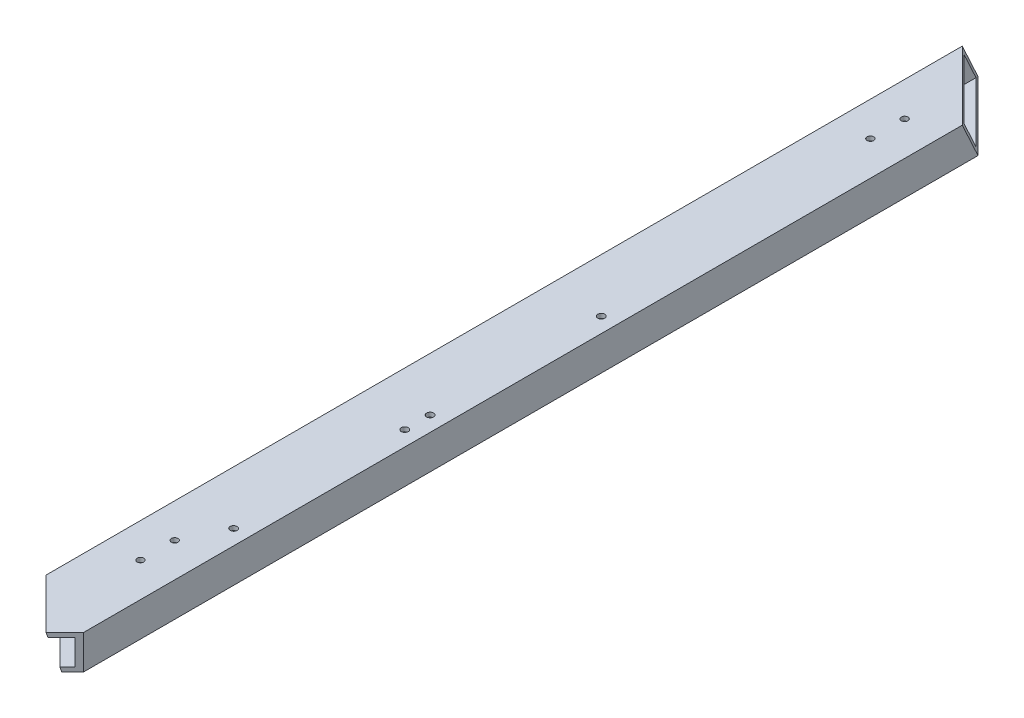
ISO-10303-21;
HEADER;
FILE_DESCRIPTION(('STEP AP214'),'2;1');
FILE_NAME('part.step','',(''),(''),'','','');
FILE_SCHEMA(('AUTOMOTIVE_DESIGN { 1 0 10303 214 1 1 1 1 }'));
ENDSEC;
DATA;
#1=APPLICATION_CONTEXT('core data for automotive mechanical design processes');
#2=APPLICATION_PROTOCOL_DEFINITION('international standard','automotive_design',2000,#1);
#3=PRODUCT_CONTEXT('',#1,'mechanical');
#4=PRODUCT('Part','Part','',(#3));
#5=PRODUCT_RELATED_PRODUCT_CATEGORY('part','',(#4));
#6=PRODUCT_DEFINITION_FORMATION('','',#4);
#7=PRODUCT_DEFINITION_CONTEXT('part definition',#1,'design');
#8=PRODUCT_DEFINITION('design','',#6,#7);
#9=PRODUCT_DEFINITION_SHAPE('','',#8);
#10=(LENGTH_UNIT() NAMED_UNIT(*) SI_UNIT(.MILLI.,.METRE.));
#11=(NAMED_UNIT(*) PLANE_ANGLE_UNIT() SI_UNIT($,.RADIAN.));
#12=(NAMED_UNIT(*) SI_UNIT($,.STERADIAN.) SOLID_ANGLE_UNIT());
#13=UNCERTAINTY_MEASURE_WITH_UNIT(LENGTH_MEASURE(1.E-05),#10,'distance_accuracy_value','');
#14=(GEOMETRIC_REPRESENTATION_CONTEXT(3) GLOBAL_UNCERTAINTY_ASSIGNED_CONTEXT((#13)) GLOBAL_UNIT_ASSIGNED_CONTEXT((#10,
#11,#12)) REPRESENTATION_CONTEXT('',''));
#15=CARTESIAN_POINT('',(0.,0.,0.));
#16=DIRECTION('',(0.,0.,1.));
#17=DIRECTION('',(1.,0.,0.));
#18=AXIS2_PLACEMENT_3D('',#15,#16,#17);
#19=CARTESIAN_POINT('',(25.4,38.1,771.9314));
#20=DIRECTION('',(-1.,0.,0.));
#21=DIRECTION('',(0.,0.,1.));
#22=AXIS2_PLACEMENT_3D('',#19,#20,#21);
#23=PLANE('',#22);
#24=DIRECTION('',(0.,0.90866085456603,0.417534970247202));
#25=VECTOR('',#24,1.);
#26=CARTESIAN_POINT('',(25.4,307.267461744109,186.155469267859));
#27=LINE('',#26,#25);
#28=CARTESIAN_POINT('',(25.3999999999999,12.7,50.7999999999986));
#29=VERTEX_POINT('',#28);
#30=CARTESIAN_POINT('',(25.4,38.1,62.4714483638043));
#31=VERTEX_POINT('',#30);
#32=EDGE_CURVE('E132',#29,#31,#27,.T.);
#33=ORIENTED_EDGE('',*,*,#32,.T.);
#34=DIRECTION('',(0.,0.,-1.));
#35=VECTOR('',#34,1.);
#36=CARTESIAN_POINT('',(25.4,38.1,771.9314));
#37=LINE('',#36,#35);
#38=CARTESIAN_POINT('',(25.4,38.1,714.375));
#39=VERTEX_POINT('',#38);
#40=EDGE_CURVE('E162',#39,#31,#37,.T.);
#41=ORIENTED_EDGE('',*,*,#40,.F.);
#42=DIRECTION('',(0.,-1.,0.));
#43=VECTOR('',#42,1.);
#44=CARTESIAN_POINT('',(25.4,38.1,714.375));
#45=LINE('',#44,#43);
#46=CARTESIAN_POINT('',(25.4,12.7,714.375));
#47=VERTEX_POINT('',#46);
#48=EDGE_CURVE('E135',#39,#47,#45,.T.);
#49=ORIENTED_EDGE('',*,*,#48,.T.);
#50=DIRECTION('',(0.,0.,-1.));
#51=VECTOR('',#50,1.);
#52=CARTESIAN_POINT('',(25.4,12.7,771.9314));
#53=LINE('',#52,#51);
#54=EDGE_CURVE('E40',#47,#29,#53,.T.);
#55=ORIENTED_EDGE('',*,*,#54,.T.);
#56=EDGE_LOOP('',(#33,#41,#49,#55));
#57=FACE_BOUND('',#56,.T.);
#58=ADVANCED_FACE('F32',(#57),#23,.F.);
#59=CARTESIAN_POINT('',(-25.4,38.1,771.9314));
#60=DIRECTION('',(1.,0.,0.));
#61=DIRECTION('',(0.,0.,-1.));
#62=AXIS2_PLACEMENT_3D('',#59,#60,#61);
#63=PLANE('',#62);
#64=DIRECTION('',(0.,0.,-1.));
#65=VECTOR('',#64,1.);
#66=CARTESIAN_POINT('',(-25.4,38.1,771.9314));
#67=LINE('',#66,#65);
#68=CARTESIAN_POINT('',(-25.4,38.1,691.557478073252));
#69=VERTEX_POINT('',#68);
#70=CARTESIAN_POINT('',(-25.4,38.1,11.6714483638057));
#71=VERTEX_POINT('',#70);
#72=EDGE_CURVE('E165',#69,#71,#67,.T.);
#73=ORIENTED_EDGE('',*,*,#72,.T.);
#74=DIRECTION('',(0.,-0.90866085456603,-0.417534970247202));
#75=VECTOR('',#74,1.);
#76=CARTESIAN_POINT('',(-25.4,326.54086403421,144.211710197931));
#77=LINE('',#76,#75);
#78=CARTESIAN_POINT('',(-25.4,12.7,0.));
#79=VERTEX_POINT('',#78);
#80=EDGE_CURVE('E138',#71,#79,#77,.T.);
#81=ORIENTED_EDGE('',*,*,#80,.T.);
#82=DIRECTION('',(0.,0.,-1.));
#83=VECTOR('',#82,1.);
#84=CARTESIAN_POINT('',(-25.4,12.7,771.9314));
#85=LINE('',#84,#83);
#86=CARTESIAN_POINT('',(-25.4000000000001,12.7,679.886029709446));
#87=VERTEX_POINT('',#86);
#88=EDGE_CURVE('E168',#87,#79,#85,.T.);
#89=ORIENTED_EDGE('',*,*,#88,.F.);
#90=DIRECTION('',(0.,-0.90866085456603,-0.417534970247202));
#91=VECTOR('',#90,1.);
#92=CARTESIAN_POINT('',(-25.4,68.5936797426668,705.569502031478));
#93=LINE('',#92,#91);
#94=EDGE_CURVE('E121',#69,#87,#93,.T.);
#95=ORIENTED_EDGE('',*,*,#94,.F.);
#96=EDGE_LOOP('',(#73,#81,#89,#95));
#97=FACE_BOUND('',#96,.T.);
#98=ADVANCED_FACE('F281',(#97),#63,.F.);
#99=CARTESIAN_POINT('',(-25.4,38.1,771.9314));
#100=DIRECTION('',(0.,-1.,0.));
#101=DIRECTION('',(0.,0.,1.));
#102=AXIS2_PLACEMENT_3D('',#99,#100,#101);
#103=PLANE('',#102);
#104=CARTESIAN_POINT('',(14.2366999999987,38.1,446.172239036629));
#105=DIRECTION('',(0.,1.,0.));
#106=DIRECTION('',(0.,0.,1.));
#107=AXIS2_PLACEMENT_3D('',#104,#105,#106);
#108=CIRCLE('',#107,2.57975099999999);
#109=CARTESIAN_POINT('',(14.2366999999987,38.1,448.751990036629));
#110=VERTEX_POINT('',#109);
#111=EDGE_CURVE('E544',#110,#110,#108,.T.);
#112=ORIENTED_EDGE('',*,*,#111,.F.);
#113=EDGE_LOOP('',(#112));
#114=FACE_BOUND('',#113,.T.);
#115=CARTESIAN_POINT('',(14.2367000000014,38.1,591.968239036627));
#116=DIRECTION('',(0.,1.,0.));
#117=DIRECTION('',(0.,0.,1.));
#118=AXIS2_PLACEMENT_3D('',#115,#116,#117);
#119=CIRCLE('',#118,2.57975099999999);
#120=CARTESIAN_POINT('',(14.2367000000014,38.1,594.547990036627));
#121=VERTEX_POINT('',#120);
#122=EDGE_CURVE('E185',#121,#121,#119,.T.);
#123=ORIENTED_EDGE('',*,*,#122,.F.);
#124=EDGE_LOOP('',(#123));
#125=FACE_BOUND('',#124,.T.);
#126=CARTESIAN_POINT('',(14.2367000000049,38.1,319.172239036625));
#127=DIRECTION('',(0.,-1.,0.));
#128=DIRECTION('',(0.,0.,-1.));
#129=AXIS2_PLACEMENT_3D('',#126,#127,#128);
#130=CIRCLE('',#129,2.57975099999999);
#131=CARTESIAN_POINT('',(14.2367000000049,38.1,316.592488036625));
#132=VERTEX_POINT('',#131);
#133=EDGE_CURVE('E182',#132,#132,#130,.T.);
#134=ORIENTED_EDGE('',*,*,#133,.T.);
#135=EDGE_LOOP('',(#134));
#136=FACE_BOUND('',#135,.T.);
#137=CARTESIAN_POINT('',(14.2367000000001,38.1,464.968239036626));
#138=DIRECTION('',(0.,-1.,0.));
#139=DIRECTION('',(0.,0.,-1.));
#140=AXIS2_PLACEMENT_3D('',#137,#138,#139);
#141=CIRCLE('',#140,2.57975099999999);
#142=CARTESIAN_POINT('',(14.2367000000001,38.1,462.388488036626));
#143=VERTEX_POINT('',#142);
#144=EDGE_CURVE('E200',#143,#143,#141,.T.);
#145=ORIENTED_EDGE('',*,*,#144,.T.);
#146=EDGE_LOOP('',(#145));
#147=FACE_BOUND('',#146,.T.);
#148=CARTESIAN_POINT('',(-6.24500451351651E-12,38.1,621.467704493594));
#149=DIRECTION('',(0.,1.,0.));
#150=DIRECTION('',(0.,0.,1.));
#151=AXIS2_PLACEMENT_3D('',#148,#149,#150);
#152=CIRCLE('',#151,2.4638);
#153=CARTESIAN_POINT('',(-6.24500451351651E-12,38.1,623.931504493594));
#154=VERTEX_POINT('',#153);
#155=EDGE_CURVE('E213',#154,#154,#152,.T.);
#156=ORIENTED_EDGE('',*,*,#155,.F.);
#157=EDGE_LOOP('',(#156));
#158=FACE_BOUND('',#157,.T.);
#159=CARTESIAN_POINT('',(-6.00561267383171E-12,38.1,646.867704493594));
#160=DIRECTION('',(0.,1.,0.));
#161=DIRECTION('',(0.,0.,1.));
#162=AXIS2_PLACEMENT_3D('',#159,#160,#161);
#163=CIRCLE('',#162,2.4638);
#164=CARTESIAN_POINT('',(-6.00561267383171E-12,38.1,649.331504493594));
#165=VERTEX_POINT('',#164);
#166=EDGE_CURVE('E225',#165,#165,#163,.T.);
#167=ORIENTED_EDGE('',*,*,#166,.F.);
#168=EDGE_LOOP('',(#167));
#169=FACE_BOUND('',#168,.T.);
#170=CARTESIAN_POINT('',(-1.99840144432528E-12,38.1,79.8576765553637));
#171=DIRECTION('',(0.,-1.,0.));
#172=DIRECTION('',(0.,0.,-1.));
#173=AXIS2_PLACEMENT_3D('',#170,#171,#172);
#174=CIRCLE('',#173,2.4638);
#175=CARTESIAN_POINT('',(-1.99840144432528E-12,38.1,77.3938765553637));
#176=VERTEX_POINT('',#175);
#177=EDGE_CURVE('E236',#176,#176,#174,.T.);
#178=ORIENTED_EDGE('',*,*,#177,.T.);
#179=EDGE_LOOP('',(#178));
#180=FACE_BOUND('',#179,.T.);
#181=CARTESIAN_POINT('',(-1.74166236988071E-12,38.1,105.257676555364));
#182=DIRECTION('',(0.,-1.,0.));
#183=DIRECTION('',(0.,0.,-1.));
#184=AXIS2_PLACEMENT_3D('',#181,#182,#183);
#185=CIRCLE('',#184,2.4638);
#186=CARTESIAN_POINT('',(-1.74166236988071E-12,38.1,102.793876555364));
#187=VERTEX_POINT('',#186);
#188=EDGE_CURVE('E248',#187,#187,#185,.T.);
#189=ORIENTED_EDGE('',*,*,#188,.T.);
#190=EDGE_LOOP('',(#189));
#191=FACE_BOUND('',#190,.T.);
#192=DIRECTION('',(-0.707106781186544,0.,0.707106781186551));
#193=VECTOR('',#192,1.);
#194=CARTESIAN_POINT('',(-3.37820000000001,38.1,743.1532));
#195=LINE('',#194,#193);
#196=CARTESIAN_POINT('',(11.4087609633743,38.1,728.366239036625));
#197=VERTEX_POINT('',#196);
#198=EDGE_CURVE('E131',#39,#197,#195,.T.);
#199=ORIENTED_EDGE('',*,*,#198,.F.);
#200=ORIENTED_EDGE('',*,*,#40,.T.);
#201=DIRECTION('',(-0.707106781186557,0.,-0.707106781186538));
#202=VECTOR('',#201,1.);
#203=CARTESIAN_POINT('',(365.740875818098,38.1,402.812324181893));
#204=LINE('',#203,#202);
#205=EDGE_CURVE('E269',#31,#71,#204,.T.);
#206=ORIENTED_EDGE('',*,*,#205,.T.);
#207=ORIENTED_EDGE('',*,*,#72,.F.);
#208=DIRECTION('',(0.707106781186551,0.,0.707106781186544));
#209=VECTOR('',#208,1.);
#210=CARTESIAN_POINT('',(-534.429166587454,38.1,182.528311485803));
#211=LINE('',#210,#209);
#212=EDGE_CURVE('E126',#69,#197,#211,.T.);
#213=ORIENTED_EDGE('',*,*,#212,.T.);
#214=EDGE_LOOP('',(#199,#200,#206,#207,#213));
#215=FACE_BOUND('',#214,.T.);
#216=ADVANCED_FACE('F290',(#114,#125,#136,#147,#158,#169,#180,#191,#215),#103,.F.);
#217=CARTESIAN_POINT('',(-22.225,34.925,771.9314));
#218=DIRECTION('',(1.,0.,0.));
#219=DIRECTION('',(0.,0.,-1.));
#220=AXIS2_PLACEMENT_3D('',#217,#218,#219);
#221=PLANE('',#220);
#222=DIRECTION('',(0.,-0.90866085456603,-0.417534970247202));
#223=VECTOR('',#222,1.);
#224=CARTESIAN_POINT('',(-22.225,64.7676071576649,706.986399330218));
#225=LINE('',#224,#223);
#226=CARTESIAN_POINT('',(-22.225,34.925,693.273547027776));
#227=VERTEX_POINT('',#226);
#228=CARTESIAN_POINT('',(-22.225,15.875,684.519960754921));
#229=VERTEX_POINT('',#228);
#230=EDGE_CURVE('E263',#227,#229,#225,.T.);
#231=ORIENTED_EDGE('',*,*,#230,.T.);
#232=DIRECTION('',(0.,0.,-1.));
#233=VECTOR('',#232,1.);
#234=CARTESIAN_POINT('',(-22.225,15.875,771.9314));
#235=LINE('',#234,#233);
#236=CARTESIAN_POINT('',(-22.2250000000001,15.875,4.63393104547549));
#237=VERTEX_POINT('',#236);
#238=EDGE_CURVE('E150',#229,#237,#235,.T.);
#239=ORIENTED_EDGE('',*,*,#238,.T.);
#240=DIRECTION('',(0.,-0.90866085456603,-0.417534970247202));
#241=VECTOR('',#240,1.);
#242=CARTESIAN_POINT('',(-22.225,322.714791449209,145.62860749667));
#243=LINE('',#242,#241);
#244=CARTESIAN_POINT('',(-22.2250000000001,34.925,13.3875173183298));
#245=VERTEX_POINT('',#244);
#246=EDGE_CURVE('E276',#245,#237,#243,.T.);
#247=ORIENTED_EDGE('',*,*,#246,.F.);
#248=DIRECTION('',(0.,0.,-1.));
#249=VECTOR('',#248,1.);
#250=CARTESIAN_POINT('',(-22.225,34.925,771.9314));
#251=LINE('',#250,#249);
#252=EDGE_CURVE('E159',#227,#245,#251,.T.);
#253=ORIENTED_EDGE('',*,*,#252,.F.);
#254=EDGE_LOOP('',(#231,#239,#247,#253));
#255=FACE_BOUND('',#254,.T.);
#256=ADVANCED_FACE('F292',(#255),#221,.T.);
#257=CARTESIAN_POINT('',(-22.225,34.925,771.9314));
#258=DIRECTION('',(0.,-1.,0.));
#259=DIRECTION('',(0.,0.,1.));
#260=AXIS2_PLACEMENT_3D('',#257,#258,#259);
#261=PLANE('',#260);
#262=CARTESIAN_POINT('',(14.2366999999987,34.925,446.172239036629));
#263=DIRECTION('',(0.,-1.,0.));
#264=DIRECTION('',(0.,0.,-1.));
#265=AXIS2_PLACEMENT_3D('',#262,#263,#264);
#266=CIRCLE('',#265,2.57975099999999);
#267=CARTESIAN_POINT('',(14.2366999999987,34.925,443.592488036629));
#268=VERTEX_POINT('',#267);
#269=EDGE_CURVE('E35',#268,#268,#266,.T.);
#270=ORIENTED_EDGE('',*,*,#269,.F.);
#271=EDGE_LOOP('',(#270));
#272=FACE_BOUND('',#271,.T.);
#273=CARTESIAN_POINT('',(14.2367000000014,34.925,591.968239036627));
#274=DIRECTION('',(0.,-1.,0.));
#275=DIRECTION('',(0.,0.,-1.));
#276=AXIS2_PLACEMENT_3D('',#273,#274,#275);
#277=CIRCLE('',#276,2.57975099999999);
#278=CARTESIAN_POINT('',(14.2367000000014,34.925,589.388488036627));
#279=VERTEX_POINT('',#278);
#280=EDGE_CURVE('E177',#279,#279,#277,.T.);
#281=ORIENTED_EDGE('',*,*,#280,.F.);
#282=EDGE_LOOP('',(#281));
#283=FACE_BOUND('',#282,.T.);
#284=CARTESIAN_POINT('',(14.2367000000049,34.925,319.172239036625));
#285=DIRECTION('',(0.,1.,0.));
#286=DIRECTION('',(0.,0.,1.));
#287=AXIS2_PLACEMENT_3D('',#284,#285,#286);
#288=CIRCLE('',#287,2.57975099999999);
#289=CARTESIAN_POINT('',(14.2367000000049,34.925,321.751990036625));
#290=VERTEX_POINT('',#289);
#291=EDGE_CURVE('E173',#290,#290,#288,.T.);
#292=ORIENTED_EDGE('',*,*,#291,.T.);
#293=EDGE_LOOP('',(#292));
#294=FACE_BOUND('',#293,.T.);
#295=CARTESIAN_POINT('',(14.2367000000001,34.925,464.968239036626));
#296=DIRECTION('',(0.,1.,0.));
#297=DIRECTION('',(0.,0.,1.));
#298=AXIS2_PLACEMENT_3D('',#295,#296,#297);
#299=CIRCLE('',#298,2.57975099999999);
#300=CARTESIAN_POINT('',(14.2367000000001,34.925,467.547990036625));
#301=VERTEX_POINT('',#300);
#302=EDGE_CURVE('E209',#301,#301,#299,.T.);
#303=ORIENTED_EDGE('',*,*,#302,.T.);
#304=EDGE_LOOP('',(#303));
#305=FACE_BOUND('',#304,.T.);
#306=CARTESIAN_POINT('',(-6.24500451351651E-12,34.925,621.467704493594));
#307=DIRECTION('',(0.,1.,0.));
#308=DIRECTION('',(0.,0.,1.));
#309=AXIS2_PLACEMENT_3D('',#306,#307,#308);
#310=CIRCLE('',#309,2.4638);
#311=CARTESIAN_POINT('',(-6.24500451351651E-12,34.925,623.931504493594));
#312=VERTEX_POINT('',#311);
#313=EDGE_CURVE('E221',#312,#312,#310,.T.);
#314=ORIENTED_EDGE('',*,*,#313,.T.);
#315=EDGE_LOOP('',(#314));
#316=FACE_BOUND('',#315,.T.);
#317=CARTESIAN_POINT('',(-6.00561267383171E-12,34.925,646.867704493594));
#318=DIRECTION('',(0.,1.,0.));
#319=DIRECTION('',(0.,0.,1.));
#320=AXIS2_PLACEMENT_3D('',#317,#318,#319);
#321=CIRCLE('',#320,2.4638);
#322=CARTESIAN_POINT('',(-6.00561267383171E-12,34.925,649.331504493594));
#323=VERTEX_POINT('',#322);
#324=EDGE_CURVE('E233',#323,#323,#321,.T.);
#325=ORIENTED_EDGE('',*,*,#324,.T.);
#326=EDGE_LOOP('',(#325));
#327=FACE_BOUND('',#326,.T.);
#328=CARTESIAN_POINT('',(-1.99840144432528E-12,34.925,79.8576765553637));
#329=DIRECTION('',(0.,1.,0.));
#330=DIRECTION('',(0.,0.,1.));
#331=AXIS2_PLACEMENT_3D('',#328,#329,#330);
#332=CIRCLE('',#331,2.4638);
#333=CARTESIAN_POINT('',(-1.99840144432528E-12,34.925,82.3214765553637));
#334=VERTEX_POINT('',#333);
#335=EDGE_CURVE('E245',#334,#334,#332,.T.);
#336=ORIENTED_EDGE('',*,*,#335,.T.);
#337=EDGE_LOOP('',(#336));
#338=FACE_BOUND('',#337,.T.);
#339=CARTESIAN_POINT('',(-1.74166236988071E-12,34.925,105.257676555364));
#340=DIRECTION('',(0.,1.,0.));
#341=DIRECTION('',(0.,0.,1.));
#342=AXIS2_PLACEMENT_3D('',#339,#340,#341);
#343=CIRCLE('',#342,2.4638);
#344=CARTESIAN_POINT('',(-1.74166236988071E-12,34.925,107.721476555364));
#345=VERTEX_POINT('',#344);
#346=EDGE_CURVE('E257',#345,#345,#343,.T.);
#347=ORIENTED_EDGE('',*,*,#346,.T.);
#348=EDGE_LOOP('',(#347));
#349=FACE_BOUND('',#348,.T.);
#350=DIRECTION('',(-0.707106781186551,0.,-0.707106781186544));
#351=VECTOR('',#350,1.);
#352=CARTESIAN_POINT('',(17.1039264861121,34.925,732.602473513887));
#353=LINE('',#352,#351);
#354=CARTESIAN_POINT('',(12.1382264861122,34.925,727.636773513888));
#355=VERTEX_POINT('',#354);
#356=EDGE_CURVE('E266',#355,#227,#353,.T.);
#357=ORIENTED_EDGE('',*,*,#356,.T.);
#358=ORIENTED_EDGE('',*,*,#252,.T.);
#359=DIRECTION('',(-0.707106781186557,0.,-0.707106781186538));
#360=VECTOR('',#359,1.);
#361=CARTESIAN_POINT('',(357.046941340835,34.925,392.659458659155));
#362=LINE('',#361,#360);
#363=CARTESIAN_POINT('',(22.225,34.9249999999999,57.8375173183287));
#364=VERTEX_POINT('',#363);
#365=EDGE_CURVE('E274',#364,#245,#362,.T.);
#366=ORIENTED_EDGE('',*,*,#365,.F.);
#367=DIRECTION('',(0.,0.,-1.));
#368=VECTOR('',#367,1.);
#369=CARTESIAN_POINT('',(22.225,34.925,771.9314));
#370=LINE('',#369,#368);
#371=CARTESIAN_POINT('',(22.225,34.925,717.55));
#372=VERTEX_POINT('',#371);
#373=EDGE_CURVE('E156',#372,#364,#370,.T.);
#374=ORIENTED_EDGE('',*,*,#373,.F.);
#375=DIRECTION('',(-0.707106781186544,0.,0.707106781186551));
#376=VECTOR('',#375,1.);
#377=CARTESIAN_POINT('',(-27.1906999999999,34.925,766.9657));
#378=LINE('',#377,#376);
#379=EDGE_CURVE('E145',#372,#355,#378,.T.);
#380=ORIENTED_EDGE('',*,*,#379,.T.);
#381=EDGE_LOOP('',(#357,#358,#366,#374,#380));
#382=FACE_BOUND('',#381,.T.);
#383=ADVANCED_FACE('F299',(#272,#283,#294,#305,#316,#327,#338,#349,#382),#261,.T.);
#384=CARTESIAN_POINT('',(22.225,34.925,771.9314));
#385=DIRECTION('',(-1.,0.,0.));
#386=DIRECTION('',(0.,1.,0.));
#387=AXIS2_PLACEMENT_3D('',#384,#385,#386);
#388=PLANE('',#387);
#389=DIRECTION('',(0.,0.,-1.));
#390=VECTOR('',#389,1.);
#391=CARTESIAN_POINT('',(22.225,15.875,771.9314));
#392=LINE('',#391,#390);
#393=CARTESIAN_POINT('',(22.225,15.875,717.55));
#394=VERTEX_POINT('',#393);
#395=CARTESIAN_POINT('',(22.225,15.875,49.0839310454743));
#396=VERTEX_POINT('',#395);
#397=EDGE_CURVE('E153',#394,#396,#392,.T.);
#398=ORIENTED_EDGE('',*,*,#397,.F.);
#399=DIRECTION('',(0.,1.,0.));
#400=VECTOR('',#399,1.);
#401=CARTESIAN_POINT('',(22.225,34.925,717.55));
#402=LINE('',#401,#400);
#403=EDGE_CURVE('E143',#394,#372,#402,.T.);
#404=ORIENTED_EDGE('',*,*,#403,.T.);
#405=ORIENTED_EDGE('',*,*,#373,.T.);
#406=DIRECTION('',(0.,0.90866085456603,0.417534970247202));
#407=VECTOR('',#406,1.);
#408=CARTESIAN_POINT('',(22.225,305.85056444537,182.329396682858));
#409=LINE('',#408,#407);
#410=EDGE_CURVE('E272',#396,#364,#409,.T.);
#411=ORIENTED_EDGE('',*,*,#410,.F.);
#412=EDGE_LOOP('',(#398,#404,#405,#411));
#413=FACE_BOUND('',#412,.T.);
#414=ADVANCED_FACE('F326',(#413),#388,.T.);
#415=CARTESIAN_POINT('',(-22.225,15.875,771.9314));
#416=DIRECTION('',(0.,1.,0.));
#417=DIRECTION('',(0.,0.,-1.));
#418=AXIS2_PLACEMENT_3D('',#415,#416,#417);
#419=PLANE('',#418);
#420=CARTESIAN_POINT('',(14.2366999999987,15.875,446.172239036629));
#421=DIRECTION('',(0.,1.,0.));
#422=DIRECTION('',(0.,0.,1.));
#423=AXIS2_PLACEMENT_3D('',#420,#421,#422);
#424=CIRCLE('',#423,2.57975099999999);
#425=CARTESIAN_POINT('',(14.2366999999987,15.875,448.751990036629));
#426=VERTEX_POINT('',#425);
#427=EDGE_CURVE('E190',#426,#426,#424,.T.);
#428=ORIENTED_EDGE('',*,*,#427,.F.);
#429=EDGE_LOOP('',(#428));
#430=FACE_BOUND('',#429,.T.);
#431=CARTESIAN_POINT('',(14.2367000000014,15.875,591.968239036627));
#432=DIRECTION('',(0.,1.,0.));
#433=DIRECTION('',(0.,0.,1.));
#434=AXIS2_PLACEMENT_3D('',#431,#432,#433);
#435=CIRCLE('',#434,2.57975099999999);
#436=CARTESIAN_POINT('',(14.2367000000014,15.875,594.547990036627));
#437=VERTEX_POINT('',#436);
#438=EDGE_CURVE('E175',#437,#437,#435,.T.);
#439=ORIENTED_EDGE('',*,*,#438,.F.);
#440=EDGE_LOOP('',(#439));
#441=FACE_BOUND('',#440,.T.);
#442=CARTESIAN_POINT('',(14.2367000000049,15.875,319.172239036625));
#443=DIRECTION('',(0.,-1.,0.));
#444=DIRECTION('',(0.,0.,-1.));
#445=AXIS2_PLACEMENT_3D('',#442,#443,#444);
#446=CIRCLE('',#445,2.57975099999999);
#447=CARTESIAN_POINT('',(14.2367000000049,15.875,316.592488036625));
#448=VERTEX_POINT('',#447);
#449=EDGE_CURVE('E171',#448,#448,#446,.T.);
#450=ORIENTED_EDGE('',*,*,#449,.T.);
#451=EDGE_LOOP('',(#450));
#452=FACE_BOUND('',#451,.T.);
#453=CARTESIAN_POINT('',(14.2367000000001,15.875,464.968239036626));
#454=DIRECTION('',(0.,-1.,0.));
#455=DIRECTION('',(0.,0.,-1.));
#456=AXIS2_PLACEMENT_3D('',#453,#454,#455);
#457=CIRCLE('',#456,2.57975099999999);
#458=CARTESIAN_POINT('',(14.2367000000001,15.875,462.388488036626));
#459=VERTEX_POINT('',#458);
#460=EDGE_CURVE('E206',#459,#459,#457,.T.);
#461=ORIENTED_EDGE('',*,*,#460,.T.);
#462=EDGE_LOOP('',(#461));
#463=FACE_BOUND('',#462,.T.);
#464=CARTESIAN_POINT('',(-6.24500451351651E-12,15.875,621.467704493594));
#465=DIRECTION('',(0.,-1.,0.));
#466=DIRECTION('',(0.,0.,-1.));
#467=AXIS2_PLACEMENT_3D('',#464,#465,#466);
#468=CIRCLE('',#467,2.4638);
#469=CARTESIAN_POINT('',(-6.24500451351651E-12,15.875,619.003904493594));
#470=VERTEX_POINT('',#469);
#471=EDGE_CURVE('E216',#470,#470,#468,.T.);
#472=ORIENTED_EDGE('',*,*,#471,.T.);
#473=EDGE_LOOP('',(#472));
#474=FACE_BOUND('',#473,.T.);
#475=CARTESIAN_POINT('',(-6.00561267383171E-12,15.875,646.867704493594));
#476=DIRECTION('',(0.,-1.,0.));
#477=DIRECTION('',(0.,0.,-1.));
#478=AXIS2_PLACEMENT_3D('',#475,#476,#477);
#479=CIRCLE('',#478,2.4638);
#480=CARTESIAN_POINT('',(-6.00561267383171E-12,15.875,644.403904493594));
#481=VERTEX_POINT('',#480);
#482=EDGE_CURVE('E228',#481,#481,#479,.T.);
#483=ORIENTED_EDGE('',*,*,#482,.T.);
#484=EDGE_LOOP('',(#483));
#485=FACE_BOUND('',#484,.T.);
#486=CARTESIAN_POINT('',(-1.99840144432528E-12,15.875,79.8576765553637));
#487=DIRECTION('',(0.,-1.,0.));
#488=DIRECTION('',(0.,0.,-1.));
#489=AXIS2_PLACEMENT_3D('',#486,#487,#488);
#490=CIRCLE('',#489,2.4638);
#491=CARTESIAN_POINT('',(-1.99840144432528E-12,15.875,77.3938765553637));
#492=VERTEX_POINT('',#491);
#493=EDGE_CURVE('E240',#492,#492,#490,.T.);
#494=ORIENTED_EDGE('',*,*,#493,.T.);
#495=EDGE_LOOP('',(#494));
#496=FACE_BOUND('',#495,.T.);
#497=CARTESIAN_POINT('',(-1.74166236988071E-12,15.875,105.257676555364));
#498=DIRECTION('',(0.,-1.,0.));
#499=DIRECTION('',(0.,0.,-1.));
#500=AXIS2_PLACEMENT_3D('',#497,#498,#499);
#501=CIRCLE('',#500,2.4638);
#502=CARTESIAN_POINT('',(-1.74166236988071E-12,15.875,102.793876555364));
#503=VERTEX_POINT('',#502);
#504=EDGE_CURVE('E252',#503,#503,#501,.T.);
#505=ORIENTED_EDGE('',*,*,#504,.T.);
#506=EDGE_LOOP('',(#505));
#507=FACE_BOUND('',#506,.T.);
#508=DIRECTION('',(0.707106781186551,0.,0.707106781186544));
#509=VECTOR('',#508,1.);
#510=CARTESIAN_POINT('',(21.4807196225392,15.875,728.22568037746));
#511=LINE('',#510,#509);
#512=CARTESIAN_POINT('',(16.5150196225393,15.875,723.25998037746));
#513=VERTEX_POINT('',#512);
#514=EDGE_CURVE('E125',#229,#513,#511,.T.);
#515=ORIENTED_EDGE('',*,*,#514,.T.);
#516=DIRECTION('',(0.707106781186544,0.,-0.707106781186551));
#517=VECTOR('',#516,1.);
#518=CARTESIAN_POINT('',(-27.1906999999999,15.875,766.9657));
#519=LINE('',#518,#517);
#520=EDGE_CURVE('E115',#513,#394,#519,.T.);
#521=ORIENTED_EDGE('',*,*,#520,.T.);
#522=ORIENTED_EDGE('',*,*,#397,.T.);
#523=DIRECTION('',(0.707106781186557,0.,0.707106781186538));
#524=VECTOR('',#523,1.);
#525=CARTESIAN_POINT('',(361.423734477262,15.875,388.282665522727));
#526=LINE('',#525,#524);
#527=EDGE_CURVE('E56',#237,#396,#526,.T.);
#528=ORIENTED_EDGE('',*,*,#527,.F.);
#529=ORIENTED_EDGE('',*,*,#238,.F.);
#530=EDGE_LOOP('',(#515,#521,#522,#528,#529));
#531=FACE_BOUND('',#530,.T.);
#532=ADVANCED_FACE('F331',(#430,#441,#452,#463,#474,#485,#496,#507,#531),#419,.T.);
#533=CARTESIAN_POINT('',(-25.4,12.7,771.9314));
#534=DIRECTION('',(0.,1.,0.));
#535=DIRECTION('',(0.,0.,-1.));
#536=AXIS2_PLACEMENT_3D('',#533,#534,#535);
#537=PLANE('',#536);
#538=CARTESIAN_POINT('',(14.2366999999987,12.7,446.172239036629));
#539=DIRECTION('',(0.,1.,0.));
#540=DIRECTION('',(0.,0.,1.));
#541=AXIS2_PLACEMENT_3D('',#538,#539,#540);
#542=CIRCLE('',#541,2.57975099999998);
#543=CARTESIAN_POINT('',(14.2366999999987,12.7,448.751990036629));
#544=VERTEX_POINT('',#543);
#545=EDGE_CURVE('E543',#544,#544,#542,.T.);
#546=ORIENTED_EDGE('',*,*,#545,.T.);
#547=EDGE_LOOP('',(#546));
#548=FACE_BOUND('',#547,.T.);
#549=CARTESIAN_POINT('',(14.2367000000014,12.7,591.968239036627));
#550=DIRECTION('',(0.,1.,0.));
#551=DIRECTION('',(0.,0.,1.));
#552=AXIS2_PLACEMENT_3D('',#549,#550,#551);
#553=CIRCLE('',#552,2.57975099999998);
#554=CARTESIAN_POINT('',(14.2367000000014,12.7,594.547990036627));
#555=VERTEX_POINT('',#554);
#556=EDGE_CURVE('E178',#555,#555,#553,.T.);
#557=ORIENTED_EDGE('',*,*,#556,.T.);
#558=EDGE_LOOP('',(#557));
#559=FACE_BOUND('',#558,.T.);
#560=CARTESIAN_POINT('',(14.2367000000049,12.7,319.172239036625));
#561=DIRECTION('',(0.,-1.,0.));
#562=DIRECTION('',(0.,0.,-1.));
#563=AXIS2_PLACEMENT_3D('',#560,#561,#562);
#564=CIRCLE('',#563,2.57975099999998);
#565=CARTESIAN_POINT('',(14.2367000000049,12.7,316.592488036625));
#566=VERTEX_POINT('',#565);
#567=EDGE_CURVE('E174',#566,#566,#564,.T.);
#568=ORIENTED_EDGE('',*,*,#567,.F.);
#569=EDGE_LOOP('',(#568));
#570=FACE_BOUND('',#569,.T.);
#571=CARTESIAN_POINT('',(14.2367000000001,12.7,464.968239036626));
#572=DIRECTION('',(0.,-1.,0.));
#573=DIRECTION('',(0.,0.,-1.));
#574=AXIS2_PLACEMENT_3D('',#571,#572,#573);
#575=CIRCLE('',#574,2.57975099999998);
#576=CARTESIAN_POINT('',(14.2367000000001,12.7,462.388488036626));
#577=VERTEX_POINT('',#576);
#578=EDGE_CURVE('E203',#577,#577,#575,.T.);
#579=ORIENTED_EDGE('',*,*,#578,.F.);
#580=EDGE_LOOP('',(#579));
#581=FACE_BOUND('',#580,.T.);
#582=CARTESIAN_POINT('',(-6.24500451351651E-12,12.7,621.467704493594));
#583=DIRECTION('',(0.,1.,0.));
#584=DIRECTION('',(0.,0.,1.));
#585=AXIS2_PLACEMENT_3D('',#582,#583,#584);
#586=CIRCLE('',#585,2.4638);
#587=CARTESIAN_POINT('',(-6.24500451351651E-12,12.7,623.931504493594));
#588=VERTEX_POINT('',#587);
#589=EDGE_CURVE('E212',#588,#588,#586,.T.);
#590=ORIENTED_EDGE('',*,*,#589,.T.);
#591=EDGE_LOOP('',(#590));
#592=FACE_BOUND('',#591,.T.);
#593=CARTESIAN_POINT('',(-6.00561267383171E-12,12.7,646.867704493594));
#594=DIRECTION('',(0.,1.,0.));
#595=DIRECTION('',(0.,0.,1.));
#596=AXIS2_PLACEMENT_3D('',#593,#594,#595);
#597=CIRCLE('',#596,2.4638);
#598=CARTESIAN_POINT('',(-6.00561267383171E-12,12.7,649.331504493594));
#599=VERTEX_POINT('',#598);
#600=EDGE_CURVE('E224',#599,#599,#597,.T.);
#601=ORIENTED_EDGE('',*,*,#600,.T.);
#602=EDGE_LOOP('',(#601));
#603=FACE_BOUND('',#602,.T.);
#604=CARTESIAN_POINT('',(-1.99840144432528E-12,12.7,79.8576765553637));
#605=DIRECTION('',(0.,-1.,0.));
#606=DIRECTION('',(0.,0.,-1.));
#607=AXIS2_PLACEMENT_3D('',#604,#605,#606);
#608=CIRCLE('',#607,2.4638);
#609=CARTESIAN_POINT('',(-1.99840144432528E-12,12.7,77.3938765553637));
#610=VERTEX_POINT('',#609);
#611=EDGE_CURVE('E237',#610,#610,#608,.T.);
#612=ORIENTED_EDGE('',*,*,#611,.F.);
#613=EDGE_LOOP('',(#612));
#614=FACE_BOUND('',#613,.T.);
#615=CARTESIAN_POINT('',(-1.74166236988071E-12,12.7,105.257676555364));
#616=DIRECTION('',(0.,-1.,0.));
#617=DIRECTION('',(0.,0.,-1.));
#618=AXIS2_PLACEMENT_3D('',#615,#616,#617);
#619=CIRCLE('',#618,2.4638);
#620=CARTESIAN_POINT('',(-1.74166236988071E-12,12.7,102.793876555364));
#621=VERTEX_POINT('',#620);
#622=EDGE_CURVE('E249',#621,#621,#619,.T.);
#623=ORIENTED_EDGE('',*,*,#622,.F.);
#624=EDGE_LOOP('',(#623));
#625=FACE_BOUND('',#624,.T.);
#626=ORIENTED_EDGE('',*,*,#88,.T.);
#627=DIRECTION('',(0.707106781186557,0.,0.707106781186538));
#628=VECTOR('',#627,1.);
#629=CARTESIAN_POINT('',(-25.4,12.7,0.));
#630=LINE('',#629,#628);
#631=EDGE_CURVE('E148',#79,#29,#630,.T.);
#632=ORIENTED_EDGE('',*,*,#631,.T.);
#633=ORIENTED_EDGE('',*,*,#54,.F.);
#634=DIRECTION('',(-0.707106781186544,0.,0.707106781186551));
#635=VECTOR('',#634,1.);
#636=CARTESIAN_POINT('',(-3.37820000000001,12.7,743.1532));
#637=LINE('',#636,#635);
#638=CARTESIAN_POINT('',(17.2444851452771,12.7,722.530514854723));
#639=VERTEX_POINT('',#638);
#640=EDGE_CURVE('E112',#47,#639,#637,.T.);
#641=ORIENTED_EDGE('',*,*,#640,.T.);
#642=DIRECTION('',(0.707106781186551,0.,0.707106781186544));
#643=VECTOR('',#642,1.);
#644=CARTESIAN_POINT('',(-528.593442405551,12.7,176.6925873039));
#645=LINE('',#644,#643);
#646=EDGE_CURVE('E118',#87,#639,#645,.T.);
#647=ORIENTED_EDGE('',*,*,#646,.F.);
#648=EDGE_LOOP('',(#626,#632,#633,#641,#647));
#649=FACE_BOUND('',#648,.T.);
#650=ADVANCED_FACE('F128',(#548,#559,#570,#581,#592,#603,#614,#625,#649),#537,.F.);
#651=CARTESIAN_POINT('',(-3.37820000000001,38.1,743.1532));
#652=DIRECTION('',(-0.707106781186551,0.,-0.707106781186544));
#653=DIRECTION('',(-0.707106781186544,0.,0.707106781186551));
#654=AXIS2_PLACEMENT_3D('',#651,#652,#653);
#655=PLANE('',#654);
#656=ORIENTED_EDGE('',*,*,#640,.F.);
#657=ORIENTED_EDGE('',*,*,#48,.F.);
#658=ORIENTED_EDGE('',*,*,#198,.T.);
#659=DIRECTION('',(0.218508012224405,-0.951056516295155,-0.218508012224409));
#660=VECTOR('',#659,1.);
#661=CARTESIAN_POINT('',(11.4087609633743,38.1,728.366239036625));
#662=LINE('',#661,#660);
#663=EDGE_CURVE('E48',#197,#355,#662,.T.);
#664=ORIENTED_EDGE('',*,*,#663,.T.);
#665=ORIENTED_EDGE('',*,*,#379,.F.);
#666=ORIENTED_EDGE('',*,*,#403,.F.);
#667=ORIENTED_EDGE('',*,*,#520,.F.);
#668=DIRECTION('',(-0.218508012224405,0.951056516295155,0.218508012224408));
#669=VECTOR('',#668,1.);
#670=CARTESIAN_POINT('',(9.99673183895158,44.245859304242,729.778268161048));
#671=LINE('',#670,#669);
#672=EDGE_CURVE('E11',#639,#513,#671,.T.);
#673=ORIENTED_EDGE('',*,*,#672,.F.);
#674=EDGE_LOOP('',(#656,#657,#658,#664,#665,#666,#667,#673));
#675=FACE_BOUND('',#674,.T.);
#676=ADVANCED_FACE('F109',(#675),#655,.F.);
#677=CARTESIAN_POINT('',(371.576600000001,12.7,396.97659999999));
#678=DIRECTION('',(0.672498511963949,0.309016994374944,-0.672498511963967));
#679=DIRECTION('',(-0.707106781186557,0.,-0.707106781186538));
#680=AXIS2_PLACEMENT_3D('',#677,#678,#679);
#681=PLANE('',#680);
#682=ORIENTED_EDGE('',*,*,#365,.T.);
#683=ORIENTED_EDGE('',*,*,#246,.T.);
#684=ORIENTED_EDGE('',*,*,#527,.T.);
#685=ORIENTED_EDGE('',*,*,#410,.T.);
#686=EDGE_LOOP('',(#682,#683,#684,#685));
#687=FACE_BOUND('',#686,.T.);
#688=ORIENTED_EDGE('',*,*,#32,.F.);
#689=ORIENTED_EDGE('',*,*,#631,.F.);
#690=ORIENTED_EDGE('',*,*,#80,.F.);
#691=ORIENTED_EDGE('',*,*,#205,.F.);
#692=EDGE_LOOP('',(#688,#689,#690,#691));
#693=FACE_BOUND('',#692,.T.);
#694=ADVANCED_FACE('F285',(#687,#693),#681,.T.);
#695=CARTESIAN_POINT('',(-534.429166587454,38.1,182.528311485803));
#696=DIRECTION('',(0.672498511963955,0.309016994374942,-0.672498511963962));
#697=DIRECTION('',(-0.707106781186551,0.,-0.707106781186544));
#698=AXIS2_PLACEMENT_3D('',#695,#696,#697);
#699=PLANE('',#698);
#700=ORIENTED_EDGE('',*,*,#212,.F.);
#701=ORIENTED_EDGE('',*,*,#94,.T.);
#702=ORIENTED_EDGE('',*,*,#646,.T.);
#703=ORIENTED_EDGE('',*,*,#672,.T.);
#704=ORIENTED_EDGE('',*,*,#514,.F.);
#705=ORIENTED_EDGE('',*,*,#230,.F.);
#706=ORIENTED_EDGE('',*,*,#356,.F.);
#707=ORIENTED_EDGE('',*,*,#663,.F.);
#708=EDGE_LOOP('',(#700,#701,#702,#703,#704,#705,#706,#707));
#709=FACE_BOUND('',#708,.T.);
#710=ADVANCED_FACE('F119',(#709),#699,.F.);
#711=CARTESIAN_POINT('',(-1.74166236988071E-12,12.7,105.257676555364));
#712=DIRECTION('',(0.,1.,0.));
#713=DIRECTION('',(0.,0.,-1.));
#714=AXIS2_PLACEMENT_3D('',#711,#712,#713);
#715=CYLINDRICAL_SURFACE('',#714,2.4638);
#716=ORIENTED_EDGE('',*,*,#504,.F.);
#717=EDGE_LOOP('',(#716));
#718=FACE_BOUND('',#717,.T.);
#719=ORIENTED_EDGE('',*,*,#622,.T.);
#720=EDGE_LOOP('',(#719));
#721=FACE_BOUND('',#720,.T.);
#722=ADVANCED_FACE('F361',(#718,#721),#715,.F.);
#723=ORIENTED_EDGE('',*,*,#346,.F.);
#724=EDGE_LOOP('',(#723));
#725=FACE_BOUND('',#724,.T.);
#726=ORIENTED_EDGE('',*,*,#188,.F.);
#727=EDGE_LOOP('',(#726));
#728=FACE_BOUND('',#727,.T.);
#729=ADVANCED_FACE('F370',(#725,#728),#715,.F.);
#730=CARTESIAN_POINT('',(-1.99840144432528E-12,12.7,79.8576765553637));
#731=DIRECTION('',(0.,1.,0.));
#732=DIRECTION('',(0.,0.,-1.));
#733=AXIS2_PLACEMENT_3D('',#730,#731,#732);
#734=CYLINDRICAL_SURFACE('',#733,2.4638);
#735=ORIENTED_EDGE('',*,*,#493,.F.);
#736=EDGE_LOOP('',(#735));
#737=FACE_BOUND('',#736,.T.);
#738=ORIENTED_EDGE('',*,*,#611,.T.);
#739=EDGE_LOOP('',(#738));
#740=FACE_BOUND('',#739,.T.);
#741=ADVANCED_FACE('F380',(#737,#740),#734,.F.);
#742=ORIENTED_EDGE('',*,*,#335,.F.);
#743=EDGE_LOOP('',(#742));
#744=FACE_BOUND('',#743,.T.);
#745=ORIENTED_EDGE('',*,*,#177,.F.);
#746=EDGE_LOOP('',(#745));
#747=FACE_BOUND('',#746,.T.);
#748=ADVANCED_FACE('F389',(#744,#747),#734,.F.);
#749=CARTESIAN_POINT('',(-6.00561267383171E-12,38.1,646.867704493594));
#750=DIRECTION('',(0.,-1.,0.));
#751=DIRECTION('',(0.,0.,1.));
#752=AXIS2_PLACEMENT_3D('',#749,#750,#751);
#753=CYLINDRICAL_SURFACE('',#752,2.4638);
#754=ORIENTED_EDGE('',*,*,#482,.F.);
#755=EDGE_LOOP('',(#754));
#756=FACE_BOUND('',#755,.T.);
#757=ORIENTED_EDGE('',*,*,#600,.F.);
#758=EDGE_LOOP('',(#757));
#759=FACE_BOUND('',#758,.T.);
#760=ADVANCED_FACE('F399',(#756,#759),#753,.F.);
#761=ORIENTED_EDGE('',*,*,#324,.F.);
#762=EDGE_LOOP('',(#761));
#763=FACE_BOUND('',#762,.T.);
#764=ORIENTED_EDGE('',*,*,#166,.T.);
#765=EDGE_LOOP('',(#764));
#766=FACE_BOUND('',#765,.T.);
#767=ADVANCED_FACE('F408',(#763,#766),#753,.F.);
#768=CARTESIAN_POINT('',(-6.24500451351651E-12,38.1,621.467704493594));
#769=DIRECTION('',(0.,-1.,0.));
#770=DIRECTION('',(0.,0.,1.));
#771=AXIS2_PLACEMENT_3D('',#768,#769,#770);
#772=CYLINDRICAL_SURFACE('',#771,2.4638);
#773=ORIENTED_EDGE('',*,*,#471,.F.);
#774=EDGE_LOOP('',(#773));
#775=FACE_BOUND('',#774,.T.);
#776=ORIENTED_EDGE('',*,*,#589,.F.);
#777=EDGE_LOOP('',(#776));
#778=FACE_BOUND('',#777,.T.);
#779=ADVANCED_FACE('F418',(#775,#778),#772,.F.);
#780=ORIENTED_EDGE('',*,*,#313,.F.);
#781=EDGE_LOOP('',(#780));
#782=FACE_BOUND('',#781,.T.);
#783=ORIENTED_EDGE('',*,*,#155,.T.);
#784=EDGE_LOOP('',(#783));
#785=FACE_BOUND('',#784,.T.);
#786=ADVANCED_FACE('F427',(#782,#785),#772,.F.);
#787=CARTESIAN_POINT('',(14.2367000000001,38.1,464.968239036626));
#788=DIRECTION('',(0.,1.,0.));
#789=DIRECTION('',(0.,0.,-1.));
#790=AXIS2_PLACEMENT_3D('',#787,#788,#789);
#791=CYLINDRICAL_SURFACE('',#790,2.57975099999999);
#792=ORIENTED_EDGE('',*,*,#460,.F.);
#793=EDGE_LOOP('',(#792));
#794=FACE_BOUND('',#793,.T.);
#795=ORIENTED_EDGE('',*,*,#578,.T.);
#796=EDGE_LOOP('',(#795));
#797=FACE_BOUND('',#796,.T.);
#798=ADVANCED_FACE('F437',(#794,#797),#791,.F.);
#799=ORIENTED_EDGE('',*,*,#302,.F.);
#800=EDGE_LOOP('',(#799));
#801=FACE_BOUND('',#800,.T.);
#802=ORIENTED_EDGE('',*,*,#144,.F.);
#803=EDGE_LOOP('',(#802));
#804=FACE_BOUND('',#803,.T.);
#805=ADVANCED_FACE('F446',(#801,#804),#791,.F.);
#806=CARTESIAN_POINT('',(14.2367000000049,38.1,319.172239036625));
#807=DIRECTION('',(0.,1.,0.));
#808=DIRECTION('',(0.,0.,-1.));
#809=AXIS2_PLACEMENT_3D('',#806,#807,#808);
#810=CYLINDRICAL_SURFACE('',#809,2.57975099999999);
#811=ORIENTED_EDGE('',*,*,#449,.F.);
#812=EDGE_LOOP('',(#811));
#813=FACE_BOUND('',#812,.T.);
#814=ORIENTED_EDGE('',*,*,#567,.T.);
#815=EDGE_LOOP('',(#814));
#816=FACE_BOUND('',#815,.T.);
#817=ADVANCED_FACE('F456',(#813,#816),#810,.F.);
#818=ORIENTED_EDGE('',*,*,#291,.F.);
#819=EDGE_LOOP('',(#818));
#820=FACE_BOUND('',#819,.T.);
#821=ORIENTED_EDGE('',*,*,#133,.F.);
#822=EDGE_LOOP('',(#821));
#823=FACE_BOUND('',#822,.T.);
#824=ADVANCED_FACE('F465',(#820,#823),#810,.F.);
#825=CARTESIAN_POINT('',(14.2367000000014,38.1,591.968239036627));
#826=DIRECTION('',(0.,1.,0.));
#827=DIRECTION('',(0.,0.,1.));
#828=AXIS2_PLACEMENT_3D('',#825,#826,#827);
#829=CYLINDRICAL_SURFACE('',#828,2.57975099999999);
#830=ORIENTED_EDGE('',*,*,#438,.T.);
#831=EDGE_LOOP('',(#830));
#832=FACE_BOUND('',#831,.T.);
#833=ORIENTED_EDGE('',*,*,#556,.F.);
#834=EDGE_LOOP('',(#833));
#835=FACE_BOUND('',#834,.T.);
#836=ADVANCED_FACE('F474',(#832,#835),#829,.F.);
#837=ORIENTED_EDGE('',*,*,#280,.T.);
#838=EDGE_LOOP('',(#837));
#839=FACE_BOUND('',#838,.T.);
#840=ORIENTED_EDGE('',*,*,#122,.T.);
#841=EDGE_LOOP('',(#840));
#842=FACE_BOUND('',#841,.T.);
#843=ADVANCED_FACE('F507',(#839,#842),#829,.F.);
#844=CARTESIAN_POINT('',(14.2366999999987,38.1,446.172239036629));
#845=DIRECTION('',(0.,1.,0.));
#846=DIRECTION('',(0.,0.,1.));
#847=AXIS2_PLACEMENT_3D('',#844,#845,#846);
#848=CYLINDRICAL_SURFACE('',#847,2.57975099999999);
#849=ORIENTED_EDGE('',*,*,#269,.T.);
#850=EDGE_LOOP('',(#849));
#851=FACE_BOUND('',#850,.T.);
#852=ORIENTED_EDGE('',*,*,#111,.T.);
#853=EDGE_LOOP('',(#852));
#854=FACE_BOUND('',#853,.T.);
#855=ADVANCED_FACE('F516',(#851,#854),#848,.F.);
#856=ORIENTED_EDGE('',*,*,#427,.T.);
#857=EDGE_LOOP('',(#856));
#858=FACE_BOUND('',#857,.T.);
#859=ORIENTED_EDGE('',*,*,#545,.F.);
#860=EDGE_LOOP('',(#859));
#861=FACE_BOUND('',#860,.T.);
#862=ADVANCED_FACE('F525',(#858,#861),#848,.F.);
#863=CLOSED_SHELL('',(#58,#98,#216,#256,#383,#414,#532,#650,#676,#694,#710,#722,#729,#741,#748,
#760,#767,#779,#786,#798,#805,#817,#824,#836,#843,#855,#862));
#864=MANIFOLD_SOLID_BREP('B2',#863);
#865=ADVANCED_BREP_SHAPE_REPRESENTATION('',(#18,#864),#14);
#866=SHAPE_DEFINITION_REPRESENTATION(#9,#865);
ENDSEC;
END-ISO-10303-21;
